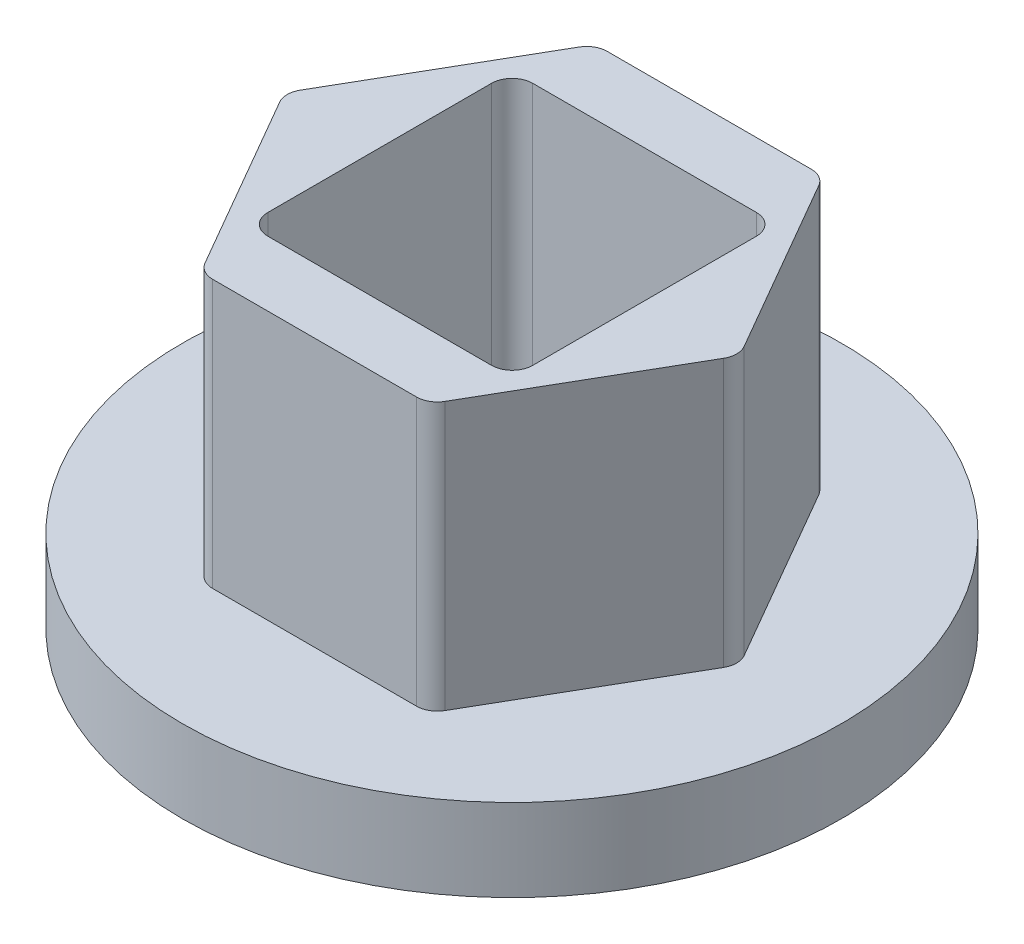
ISO-10303-21;
HEADER;
FILE_DESCRIPTION(('STEP AP214'),'2;1');
FILE_NAME('part.step','',(''),(''),'','','');
FILE_SCHEMA(('AUTOMOTIVE_DESIGN { 1 0 10303 214 1 1 1 1 }'));
ENDSEC;
DATA;
#1=APPLICATION_CONTEXT('core data for automotive mechanical design processes');
#2=APPLICATION_PROTOCOL_DEFINITION('international standard','automotive_design',2000,#1);
#3=PRODUCT_CONTEXT('',#1,'mechanical');
#4=PRODUCT('Part','Part','',(#3));
#5=PRODUCT_RELATED_PRODUCT_CATEGORY('part','',(#4));
#6=PRODUCT_DEFINITION_FORMATION('','',#4);
#7=PRODUCT_DEFINITION_CONTEXT('part definition',#1,'design');
#8=PRODUCT_DEFINITION('design','',#6,#7);
#9=PRODUCT_DEFINITION_SHAPE('','',#8);
#10=(LENGTH_UNIT() NAMED_UNIT(*) SI_UNIT(.MILLI.,.METRE.));
#11=(NAMED_UNIT(*) PLANE_ANGLE_UNIT() SI_UNIT($,.RADIAN.));
#12=(NAMED_UNIT(*) SI_UNIT($,.STERADIAN.) SOLID_ANGLE_UNIT());
#13=UNCERTAINTY_MEASURE_WITH_UNIT(LENGTH_MEASURE(1.E-05),#10,'distance_accuracy_value','');
#14=(GEOMETRIC_REPRESENTATION_CONTEXT(3) GLOBAL_UNCERTAINTY_ASSIGNED_CONTEXT((#13)) GLOBAL_UNIT_ASSIGNED_CONTEXT((#10,
#11,#12)) REPRESENTATION_CONTEXT('',''));
#15=CARTESIAN_POINT('',(0.,0.,0.));
#16=DIRECTION('',(0.,0.,1.));
#17=DIRECTION('',(1.,0.,0.));
#18=AXIS2_PLACEMENT_3D('',#15,#16,#17);
#19=CARTESIAN_POINT('',(-2.76550778941829,6.5,0.261150073207861));
#20=DIRECTION('',(0.,0.,-1.));
#21=DIRECTION('',(-1.,0.,0.));
#22=AXIS2_PLACEMENT_3D('',#19,#20,#21);
#23=PLANE('',#22);
#24=DIRECTION('',(1.,0.,0.));
#25=VECTOR('',#24,1.);
#26=CARTESIAN_POINT('',(-2.76550778941829,0.,0.261150073207861));
#27=LINE('',#26,#25);
#28=CARTESIAN_POINT('',(-2.47683265482348,0.,0.26115007320786));
#29=VERTEX_POINT('',#28);
#30=CARTESIAN_POINT('',(2.47683265482351,0.,0.261150073207841));
#31=VERTEX_POINT('',#30);
#32=EDGE_CURVE('E347',#29,#31,#27,.T.);
#33=ORIENTED_EDGE('',*,*,#32,.T.);
#34=DIRECTION('',(0.,-1.,0.));
#35=VECTOR('',#34,1.);
#36=CARTESIAN_POINT('',(2.47683265482351,6.5,0.261150073207841));
#37=LINE('',#36,#35);
#38=CARTESIAN_POINT('',(2.47683265482351,6.5,0.261150073207841));
#39=VERTEX_POINT('',#38);
#40=EDGE_CURVE('E317',#31,#39,#37,.F.);
#41=ORIENTED_EDGE('',*,*,#40,.T.);
#42=DIRECTION('',(1.,0.,0.));
#43=VECTOR('',#42,1.);
#44=CARTESIAN_POINT('',(-2.76550778941829,6.5,0.261150073207861));
#45=LINE('',#44,#43);
#46=CARTESIAN_POINT('',(-2.47683265482348,6.5,0.26115007320786));
#47=VERTEX_POINT('',#46);
#48=EDGE_CURVE('E370',#47,#39,#45,.T.);
#49=ORIENTED_EDGE('',*,*,#48,.F.);
#50=DIRECTION('',(0.,-1.,0.));
#51=VECTOR('',#50,1.);
#52=CARTESIAN_POINT('',(-2.47683265482348,6.5,0.26115007320786));
#53=LINE('',#52,#51);
#54=EDGE_CURVE('E314',#47,#29,#53,.T.);
#55=ORIENTED_EDGE('',*,*,#54,.T.);
#56=EDGE_LOOP('',(#33,#41,#49,#55));
#57=FACE_BOUND('',#56,.T.);
#58=ADVANCED_FACE('F39',(#57),#23,.F.);
#59=CARTESIAN_POINT('',(2.76550778941833,6.5,0.261150073207839));
#60=DIRECTION('',(-0.86602540378444,0.,-0.499999999999997));
#61=DIRECTION('',(-0.499999999999997,0.,0.86602540378444));
#62=AXIS2_PLACEMENT_3D('',#59,#60,#61);
#63=PLANE('',#62);
#64=DIRECTION('',(0.499999999999997,0.,-0.86602540378444));
#65=VECTOR('',#64,1.);
#66=CARTESIAN_POINT('',(2.76550778941833,0.,0.261150073207839));
#67=LINE('',#66,#65);
#68=CARTESIAN_POINT('',(2.90984535671573,0.,0.0111500732078394));
#69=VERTEX_POINT('',#68);
#70=CARTESIAN_POINT('',(5.38667801153921,0.,-4.27884992679217));
#71=VERTEX_POINT('',#70);
#72=EDGE_CURVE('E335',#69,#71,#67,.T.);
#73=ORIENTED_EDGE('',*,*,#72,.T.);
#74=DIRECTION('',(0.,-1.,0.));
#75=VECTOR('',#74,1.);
#76=CARTESIAN_POINT('',(5.38667801153921,6.5,-4.27884992679217));
#77=LINE('',#76,#75);
#78=CARTESIAN_POINT('',(5.38667801153921,6.5,-4.27884992679217));
#79=VERTEX_POINT('',#78);
#80=EDGE_CURVE('E311',#71,#79,#77,.F.);
#81=ORIENTED_EDGE('',*,*,#80,.T.);
#82=DIRECTION('',(0.499999999999997,0.,-0.86602540378444));
#83=VECTOR('',#82,1.);
#84=CARTESIAN_POINT('',(2.76550778941833,6.5,0.261150073207839));
#85=LINE('',#84,#83);
#86=CARTESIAN_POINT('',(2.90984535671573,6.5,0.0111500732078394));
#87=VERTEX_POINT('',#86);
#88=EDGE_CURVE('E358',#87,#79,#85,.T.);
#89=ORIENTED_EDGE('',*,*,#88,.F.);
#90=DIRECTION('',(0.,-1.,0.));
#91=VECTOR('',#90,1.);
#92=CARTESIAN_POINT('',(2.90984535671573,6.5,0.0111500732078392));
#93=LINE('',#92,#91);
#94=EDGE_CURVE('E307',#87,#69,#93,.T.);
#95=ORIENTED_EDGE('',*,*,#94,.T.);
#96=EDGE_LOOP('',(#73,#81,#89,#95));
#97=FACE_BOUND('',#96,.T.);
#98=ADVANCED_FACE('F342',(#97),#63,.F.);
#99=CARTESIAN_POINT('',(5.53101557883662,6.5,-4.52884992679217));
#100=DIRECTION('',(-0.866025403784437,0.,0.500000000000003));
#101=DIRECTION('',(0.500000000000003,0.,0.866025403784437));
#102=AXIS2_PLACEMENT_3D('',#99,#100,#101);
#103=PLANE('',#102);
#104=DIRECTION('',(-0.500000000000003,0.,-0.866025403784437));
#105=VECTOR('',#104,1.);
#106=CARTESIAN_POINT('',(5.53101557883662,0.,-4.52884992679217));
#107=LINE('',#106,#105);
#108=CARTESIAN_POINT('',(5.38667801153921,0.,-4.77884992679217));
#109=VERTEX_POINT('',#108);
#110=CARTESIAN_POINT('',(2.9098453567157,0.,-9.06884992679216));
#111=VERTEX_POINT('',#110);
#112=EDGE_CURVE('E337',#109,#111,#107,.T.);
#113=ORIENTED_EDGE('',*,*,#112,.T.);
#114=DIRECTION('',(0.,-1.,0.));
#115=VECTOR('',#114,1.);
#116=CARTESIAN_POINT('',(2.9098453567157,6.5,-9.06884992679216));
#117=LINE('',#116,#115);
#118=CARTESIAN_POINT('',(2.9098453567157,6.5,-9.06884992679216));
#119=VERTEX_POINT('',#118);
#120=EDGE_CURVE('E304',#111,#119,#117,.F.);
#121=ORIENTED_EDGE('',*,*,#120,.T.);
#122=DIRECTION('',(-0.500000000000003,0.,-0.866025403784437));
#123=VECTOR('',#122,1.);
#124=CARTESIAN_POINT('',(5.53101557883662,6.5,-4.52884992679217));
#125=LINE('',#124,#123);
#126=CARTESIAN_POINT('',(5.38667801153921,6.5,-4.77884992679217));
#127=VERTEX_POINT('',#126);
#128=EDGE_CURVE('E356',#127,#119,#125,.T.);
#129=ORIENTED_EDGE('',*,*,#128,.F.);
#130=DIRECTION('',(0.,-1.,0.));
#131=VECTOR('',#130,1.);
#132=CARTESIAN_POINT('',(5.38667801153921,6.5,-4.77884992679217));
#133=LINE('',#132,#131);
#134=EDGE_CURVE('E300',#127,#109,#133,.T.);
#135=ORIENTED_EDGE('',*,*,#134,.T.);
#136=EDGE_LOOP('',(#113,#121,#129,#135));
#137=FACE_BOUND('',#136,.T.);
#138=ADVANCED_FACE('F360',(#137),#103,.F.);
#139=CARTESIAN_POINT('',(2.76550778941829,6.5,-9.31884992679216));
#140=DIRECTION('',(0.,0.,1.));
#141=DIRECTION('',(1.,0.,0.));
#142=AXIS2_PLACEMENT_3D('',#139,#140,#141);
#143=PLANE('',#142);
#144=DIRECTION('',(-1.,0.,0.));
#145=VECTOR('',#144,1.);
#146=CARTESIAN_POINT('',(2.76550778941829,0.,-9.31884992679216));
#147=LINE('',#146,#145);
#148=CARTESIAN_POINT('',(2.47683265482348,0.,-9.31884992679216));
#149=VERTEX_POINT('',#148);
#150=CARTESIAN_POINT('',(-2.47683265482351,0.,-9.31884992679214));
#151=VERTEX_POINT('',#150);
#152=EDGE_CURVE('E384',#149,#151,#147,.T.);
#153=ORIENTED_EDGE('',*,*,#152,.T.);
#154=DIRECTION('',(0.,-1.,0.));
#155=VECTOR('',#154,1.);
#156=CARTESIAN_POINT('',(-2.47683265482351,6.5,-9.31884992679214));
#157=LINE('',#156,#155);
#158=CARTESIAN_POINT('',(-2.47683265482351,6.5,-9.31884992679214));
#159=VERTEX_POINT('',#158);
#160=EDGE_CURVE('E297',#151,#159,#157,.F.);
#161=ORIENTED_EDGE('',*,*,#160,.T.);
#162=DIRECTION('',(-1.,0.,0.));
#163=VECTOR('',#162,1.);
#164=CARTESIAN_POINT('',(2.76550778941829,6.5,-9.31884992679216));
#165=LINE('',#164,#163);
#166=CARTESIAN_POINT('',(2.47683265482348,6.5,-9.31884992679216));
#167=VERTEX_POINT('',#166);
#168=EDGE_CURVE('E363',#167,#159,#165,.T.);
#169=ORIENTED_EDGE('',*,*,#168,.F.);
#170=DIRECTION('',(0.,-1.,0.));
#171=VECTOR('',#170,1.);
#172=CARTESIAN_POINT('',(2.47683265482348,6.5,-9.31884992679216));
#173=LINE('',#172,#171);
#174=EDGE_CURVE('E293',#167,#149,#173,.T.);
#175=ORIENTED_EDGE('',*,*,#174,.T.);
#176=EDGE_LOOP('',(#153,#161,#169,#175));
#177=FACE_BOUND('',#176,.T.);
#178=ADVANCED_FACE('F509',(#177),#143,.F.);
#179=CARTESIAN_POINT('',(-2.76550778941833,6.5,-9.31884992679214));
#180=DIRECTION('',(0.86602540378444,0.,0.499999999999997));
#181=DIRECTION('',(0.499999999999997,0.,-0.86602540378444));
#182=AXIS2_PLACEMENT_3D('',#179,#180,#181);
#183=PLANE('',#182);
#184=DIRECTION('',(-0.499999999999997,0.,0.86602540378444));
#185=VECTOR('',#184,1.);
#186=CARTESIAN_POINT('',(-2.76550778941833,0.,-9.31884992679214));
#187=LINE('',#186,#185);
#188=CARTESIAN_POINT('',(-2.90984535671573,0.,-9.06884992679214));
#189=VERTEX_POINT('',#188);
#190=CARTESIAN_POINT('',(-5.38667801153921,0.,-4.77884992679213));
#191=VERTEX_POINT('',#190);
#192=EDGE_CURVE('E388',#189,#191,#187,.T.);
#193=ORIENTED_EDGE('',*,*,#192,.T.);
#194=DIRECTION('',(0.,-1.,0.));
#195=VECTOR('',#194,1.);
#196=CARTESIAN_POINT('',(-5.38667801153921,6.5,-4.77884992679213));
#197=LINE('',#196,#195);
#198=CARTESIAN_POINT('',(-5.38667801153921,6.5,-4.77884992679213));
#199=VERTEX_POINT('',#198);
#200=EDGE_CURVE('E272',#191,#199,#197,.F.);
#201=ORIENTED_EDGE('',*,*,#200,.T.);
#202=DIRECTION('',(-0.499999999999997,0.,0.86602540378444));
#203=VECTOR('',#202,1.);
#204=CARTESIAN_POINT('',(-2.76550778941833,6.5,-9.31884992679214));
#205=LINE('',#204,#203);
#206=CARTESIAN_POINT('',(-2.90984535671573,6.5,-9.06884992679214));
#207=VERTEX_POINT('',#206);
#208=EDGE_CURVE('E368',#207,#199,#205,.T.);
#209=ORIENTED_EDGE('',*,*,#208,.F.);
#210=DIRECTION('',(0.,-1.,0.));
#211=VECTOR('',#210,1.);
#212=CARTESIAN_POINT('',(-2.90984535671573,6.5,-9.06884992679214));
#213=LINE('',#212,#211);
#214=EDGE_CURVE('E268',#207,#189,#213,.T.);
#215=ORIENTED_EDGE('',*,*,#214,.T.);
#216=EDGE_LOOP('',(#193,#201,#209,#215));
#217=FACE_BOUND('',#216,.T.);
#218=ADVANCED_FACE('F456',(#217),#183,.F.);
#219=CARTESIAN_POINT('',(-5.53101557883662,6.5,-4.52884992679213));
#220=DIRECTION('',(0.866025403784437,0.,-0.500000000000003));
#221=DIRECTION('',(-0.500000000000003,0.,-0.866025403784437));
#222=AXIS2_PLACEMENT_3D('',#219,#220,#221);
#223=PLANE('',#222);
#224=DIRECTION('',(0.500000000000003,0.,0.866025403784437));
#225=VECTOR('',#224,1.);
#226=CARTESIAN_POINT('',(-5.53101557883662,6.5,-4.52884992679213));
#227=LINE('',#226,#225);
#228=CARTESIAN_POINT('',(-5.38667801153921,6.5,-4.27884992679213));
#229=VERTEX_POINT('',#228);
#230=CARTESIAN_POINT('',(-2.9098453567157,6.5,0.0111500732078622));
#231=VERTEX_POINT('',#230);
#232=EDGE_CURVE('E215',#229,#231,#227,.T.);
#233=ORIENTED_EDGE('',*,*,#232,.F.);
#234=DIRECTION('',(0.,-1.,0.));
#235=VECTOR('',#234,1.);
#236=CARTESIAN_POINT('',(-5.38667801153921,6.5,-4.27884992679213));
#237=LINE('',#236,#235);
#238=CARTESIAN_POINT('',(-5.38667801153921,0.,-4.27884992679213));
#239=VERTEX_POINT('',#238);
#240=EDGE_CURVE('E264',#229,#239,#237,.T.);
#241=ORIENTED_EDGE('',*,*,#240,.T.);
#242=DIRECTION('',(0.500000000000003,0.,0.866025403784437));
#243=VECTOR('',#242,1.);
#244=CARTESIAN_POINT('',(-5.53101557883662,0.,-4.52884992679213));
#245=LINE('',#244,#243);
#246=CARTESIAN_POINT('',(-2.9098453567157,0.,0.0111500732078622));
#247=VERTEX_POINT('',#246);
#248=EDGE_CURVE('E391',#239,#247,#245,.T.);
#249=ORIENTED_EDGE('',*,*,#248,.T.);
#250=DIRECTION('',(0.,-1.,0.));
#251=VECTOR('',#250,1.);
#252=CARTESIAN_POINT('',(-2.9098453567157,6.5,0.0111500732078622));
#253=LINE('',#252,#251);
#254=EDGE_CURVE('E261',#247,#231,#253,.F.);
#255=ORIENTED_EDGE('',*,*,#254,.T.);
#256=EDGE_LOOP('',(#233,#241,#249,#255));
#257=FACE_BOUND('',#256,.T.);
#258=ADVANCED_FACE('F447',(#257),#223,.F.);
#259=CARTESIAN_POINT('',(0.,6.5,0.));
#260=DIRECTION('',(0.,1.,0.));
#261=DIRECTION('',(0.,0.,1.));
#262=AXIS2_PLACEMENT_3D('',#259,#260,#261);
#263=PLANE('',#262);
#264=DIRECTION('',(-1.,0.,0.));
#265=VECTOR('',#264,1.);
#266=CARTESIAN_POINT('',(0.,6.5,-7.74384992679215));
#267=LINE('',#266,#265);
#268=CARTESIAN_POINT('',(2.72,6.5,-7.74384992679215));
#269=VERTEX_POINT('',#268);
#270=CARTESIAN_POINT('',(-2.71,6.5,-7.74384992679215));
#271=VERTEX_POINT('',#270);
#272=EDGE_CURVE('E405',#269,#271,#267,.T.);
#273=ORIENTED_EDGE('',*,*,#272,.F.);
#274=CARTESIAN_POINT('',(2.72,6.5,-7.24384992679215));
#275=DIRECTION('',(0.,1.,0.));
#276=DIRECTION('',(0.,0.,1.));
#277=AXIS2_PLACEMENT_3D('',#274,#275,#276);
#278=CIRCLE('',#277,0.5);
#279=CARTESIAN_POINT('',(3.22,6.5,-7.24384992679215));
#280=VERTEX_POINT('',#279);
#281=EDGE_CURVE('E247',#269,#280,#278,.F.);
#282=ORIENTED_EDGE('',*,*,#281,.T.);
#283=DIRECTION('',(0.,0.,-1.));
#284=VECTOR('',#283,1.);
#285=CARTESIAN_POINT('',(3.22,6.5,0.));
#286=LINE('',#285,#284);
#287=CARTESIAN_POINT('',(3.22,6.5,-1.81384992679215));
#288=VERTEX_POINT('',#287);
#289=EDGE_CURVE('E418',#288,#280,#286,.T.);
#290=ORIENTED_EDGE('',*,*,#289,.F.);
#291=CARTESIAN_POINT('',(2.72,6.5,-1.81384992679215));
#292=DIRECTION('',(0.,1.,0.));
#293=DIRECTION('',(0.,0.,1.));
#294=AXIS2_PLACEMENT_3D('',#291,#292,#293);
#295=CIRCLE('',#294,0.5);
#296=CARTESIAN_POINT('',(2.72,6.5,-1.31384992679215));
#297=VERTEX_POINT('',#296);
#298=EDGE_CURVE('E187',#288,#297,#295,.F.);
#299=ORIENTED_EDGE('',*,*,#298,.T.);
#300=DIRECTION('',(-1.,0.,0.));
#301=VECTOR('',#300,1.);
#302=CARTESIAN_POINT('',(0.,6.5,-1.31384992679215));
#303=LINE('',#302,#301);
#304=CARTESIAN_POINT('',(-2.71,6.5,-1.31384992679215));
#305=VERTEX_POINT('',#304);
#306=EDGE_CURVE('E197',#297,#305,#303,.T.);
#307=ORIENTED_EDGE('',*,*,#306,.T.);
#308=CARTESIAN_POINT('',(-2.71,6.5,-1.81384992679215));
#309=DIRECTION('',(0.,1.,0.));
#310=DIRECTION('',(0.,0.,1.));
#311=AXIS2_PLACEMENT_3D('',#308,#309,#310);
#312=CIRCLE('',#311,0.5);
#313=CARTESIAN_POINT('',(-3.21,6.5,-1.81384992679215));
#314=VERTEX_POINT('',#313);
#315=EDGE_CURVE('E258',#305,#314,#312,.F.);
#316=ORIENTED_EDGE('',*,*,#315,.T.);
#317=DIRECTION('',(0.,0.,-1.));
#318=VECTOR('',#317,1.);
#319=CARTESIAN_POINT('',(-3.21,6.5,0.));
#320=LINE('',#319,#318);
#321=CARTESIAN_POINT('',(-3.21,6.5,-7.24384992679215));
#322=VERTEX_POINT('',#321);
#323=EDGE_CURVE('E412',#314,#322,#320,.T.);
#324=ORIENTED_EDGE('',*,*,#323,.T.);
#325=CARTESIAN_POINT('',(-2.71,6.5,-7.24384992679215));
#326=DIRECTION('',(0.,1.,0.));
#327=DIRECTION('',(0.,0.,1.));
#328=AXIS2_PLACEMENT_3D('',#325,#326,#327);
#329=CIRCLE('',#328,0.5);
#330=EDGE_CURVE('E253',#322,#271,#329,.F.);
#331=ORIENTED_EDGE('',*,*,#330,.T.);
#332=EDGE_LOOP('',(#273,#282,#290,#299,#307,#316,#324,#331));
#333=FACE_BOUND('',#332,.T.);
#334=ORIENTED_EDGE('',*,*,#208,.T.);
#335=CARTESIAN_POINT('',(-4.95366530964699,6.5,-4.52884992679213));
#336=DIRECTION('',(0.,1.,0.));
#337=DIRECTION('',(0.,0.,1.));
#338=AXIS2_PLACEMENT_3D('',#335,#336,#337);
#339=CIRCLE('',#338,0.5);
#340=EDGE_CURVE('E290',#199,#229,#339,.T.);
#341=ORIENTED_EDGE('',*,*,#340,.T.);
#342=ORIENTED_EDGE('',*,*,#232,.T.);
#343=CARTESIAN_POINT('',(-2.47683265482348,6.5,-0.23884992679214));
#344=DIRECTION('',(0.,1.,0.));
#345=DIRECTION('',(0.,0.,1.));
#346=AXIS2_PLACEMENT_3D('',#343,#344,#345);
#347=CIRCLE('',#346,0.5);
#348=EDGE_CURVE('E275',#231,#47,#347,.T.);
#349=ORIENTED_EDGE('',*,*,#348,.T.);
#350=ORIENTED_EDGE('',*,*,#48,.T.);
#351=CARTESIAN_POINT('',(2.47683265482351,6.5,-0.238849926792159));
#352=DIRECTION('',(0.,1.,0.));
#353=DIRECTION('',(0.,0.,1.));
#354=AXIS2_PLACEMENT_3D('',#351,#352,#353);
#355=CIRCLE('',#354,0.5);
#356=EDGE_CURVE('E278',#39,#87,#355,.T.);
#357=ORIENTED_EDGE('',*,*,#356,.T.);
#358=ORIENTED_EDGE('',*,*,#88,.T.);
#359=CARTESIAN_POINT('',(4.95366530964699,6.5,-4.52884992679217));
#360=DIRECTION('',(0.,1.,0.));
#361=DIRECTION('',(0.,0.,1.));
#362=AXIS2_PLACEMENT_3D('',#359,#360,#361);
#363=CIRCLE('',#362,0.5);
#364=EDGE_CURVE('E281',#79,#127,#363,.T.);
#365=ORIENTED_EDGE('',*,*,#364,.T.);
#366=ORIENTED_EDGE('',*,*,#128,.T.);
#367=CARTESIAN_POINT('',(2.47683265482348,6.5,-8.81884992679216));
#368=DIRECTION('',(0.,1.,0.));
#369=DIRECTION('',(0.,0.,1.));
#370=AXIS2_PLACEMENT_3D('',#367,#368,#369);
#371=CIRCLE('',#370,0.5);
#372=EDGE_CURVE('E284',#119,#167,#371,.T.);
#373=ORIENTED_EDGE('',*,*,#372,.T.);
#374=ORIENTED_EDGE('',*,*,#168,.T.);
#375=CARTESIAN_POINT('',(-2.47683265482351,6.5,-8.81884992679214));
#376=DIRECTION('',(0.,1.,0.));
#377=DIRECTION('',(0.,0.,1.));
#378=AXIS2_PLACEMENT_3D('',#375,#376,#377);
#379=CIRCLE('',#378,0.5);
#380=EDGE_CURVE('E287',#159,#207,#379,.T.);
#381=ORIENTED_EDGE('',*,*,#380,.T.);
#382=EDGE_LOOP('',(#334,#341,#342,#349,#350,#357,#358,#365,#366,#373,#374,#381));
#383=FACE_BOUND('',#382,.T.);
#384=ADVANCED_FACE('F355',(#333,#383),#263,.T.);
#385=CARTESIAN_POINT('',(0.,0.,-4.52884992679215));
#386=DIRECTION('',(0.,1.,0.));
#387=DIRECTION('',(0.,0.,1.));
#388=AXIS2_PLACEMENT_3D('',#385,#386,#387);
#389=PLANE('',#388);
#390=CARTESIAN_POINT('',(0.,0.,-4.52884992679215));
#391=DIRECTION('',(0.,1.,0.));
#392=DIRECTION('',(0.,0.,1.));
#393=AXIS2_PLACEMENT_3D('',#390,#391,#392);
#394=CIRCLE('',#393,8.);
#395=CARTESIAN_POINT('',(0.,0.,3.47115007320785));
#396=VERTEX_POINT('',#395);
#397=EDGE_CURVE('E401',#396,#396,#394,.T.);
#398=ORIENTED_EDGE('',*,*,#397,.T.);
#399=EDGE_LOOP('',(#398));
#400=FACE_BOUND('',#399,.T.);
#401=ORIENTED_EDGE('',*,*,#32,.F.);
#402=CARTESIAN_POINT('',(-2.47683265482348,0.,-0.23884992679214));
#403=DIRECTION('',(0.,1.,0.));
#404=DIRECTION('',(0.,0.,1.));
#405=AXIS2_PLACEMENT_3D('',#402,#403,#404);
#406=CIRCLE('',#405,0.5);
#407=EDGE_CURVE('E11',#29,#247,#406,.F.);
#408=ORIENTED_EDGE('',*,*,#407,.T.);
#409=ORIENTED_EDGE('',*,*,#248,.F.);
#410=CARTESIAN_POINT('',(-4.95366530964699,0.,-4.52884992679213));
#411=DIRECTION('',(0.,1.,0.));
#412=DIRECTION('',(0.,0.,1.));
#413=AXIS2_PLACEMENT_3D('',#410,#411,#412);
#414=CIRCLE('',#413,0.5);
#415=EDGE_CURVE('E320',#239,#191,#414,.F.);
#416=ORIENTED_EDGE('',*,*,#415,.T.);
#417=ORIENTED_EDGE('',*,*,#192,.F.);
#418=CARTESIAN_POINT('',(-2.47683265482351,0.,-8.81884992679214));
#419=DIRECTION('',(0.,1.,0.));
#420=DIRECTION('',(0.,0.,1.));
#421=AXIS2_PLACEMENT_3D('',#418,#419,#420);
#422=CIRCLE('',#421,0.5);
#423=EDGE_CURVE('E323',#189,#151,#422,.F.);
#424=ORIENTED_EDGE('',*,*,#423,.T.);
#425=ORIENTED_EDGE('',*,*,#152,.F.);
#426=CARTESIAN_POINT('',(2.47683265482348,0.,-8.81884992679216));
#427=DIRECTION('',(0.,1.,0.));
#428=DIRECTION('',(0.,0.,1.));
#429=AXIS2_PLACEMENT_3D('',#426,#427,#428);
#430=CIRCLE('',#429,0.5);
#431=EDGE_CURVE('E326',#149,#111,#430,.F.);
#432=ORIENTED_EDGE('',*,*,#431,.T.);
#433=ORIENTED_EDGE('',*,*,#112,.F.);
#434=CARTESIAN_POINT('',(4.95366530964699,0.,-4.52884992679217));
#435=DIRECTION('',(0.,1.,0.));
#436=DIRECTION('',(0.,0.,1.));
#437=AXIS2_PLACEMENT_3D('',#434,#435,#436);
#438=CIRCLE('',#437,0.5);
#439=EDGE_CURVE('E329',#109,#71,#438,.F.);
#440=ORIENTED_EDGE('',*,*,#439,.T.);
#441=ORIENTED_EDGE('',*,*,#72,.F.);
#442=CARTESIAN_POINT('',(2.47683265482351,0.,-0.238849926792159));
#443=DIRECTION('',(0.,1.,0.));
#444=DIRECTION('',(0.,0.,1.));
#445=AXIS2_PLACEMENT_3D('',#442,#443,#444);
#446=CIRCLE('',#445,0.5);
#447=EDGE_CURVE('E48',#69,#31,#446,.F.);
#448=ORIENTED_EDGE('',*,*,#447,.T.);
#449=EDGE_LOOP('',(#401,#408,#409,#416,#417,#424,#425,#432,#433,#440,#441,#448));
#450=FACE_BOUND('',#449,.T.);
#451=ADVANCED_FACE('F334',(#400,#450),#389,.T.);
#452=CARTESIAN_POINT('',(0.,-2.,-4.52884992679215));
#453=DIRECTION('',(0.,1.,0.));
#454=DIRECTION('',(0.,0.,1.));
#455=AXIS2_PLACEMENT_3D('',#452,#453,#454);
#456=CYLINDRICAL_SURFACE('',#455,8.);
#457=CARTESIAN_POINT('',(0.,-2.,-4.52884992679215));
#458=DIRECTION('',(0.,1.,0.));
#459=DIRECTION('',(0.,0.,1.));
#460=AXIS2_PLACEMENT_3D('',#457,#458,#459);
#461=CIRCLE('',#460,8.);
#462=CARTESIAN_POINT('',(0.,-2.,3.47115007320785));
#463=VERTEX_POINT('',#462);
#464=EDGE_CURVE('E380',#463,#463,#461,.T.);
#465=ORIENTED_EDGE('',*,*,#464,.T.);
#466=EDGE_LOOP('',(#465));
#467=FACE_BOUND('',#466,.T.);
#468=ORIENTED_EDGE('',*,*,#397,.F.);
#469=EDGE_LOOP('',(#468));
#470=FACE_BOUND('',#469,.T.);
#471=ADVANCED_FACE('F453',(#467,#470),#456,.T.);
#472=CARTESIAN_POINT('',(0.,-2.,-4.52884992679215));
#473=DIRECTION('',(0.,1.,0.));
#474=DIRECTION('',(0.,0.,1.));
#475=AXIS2_PLACEMENT_3D('',#472,#473,#474);
#476=PLANE('',#475);
#477=DIRECTION('',(-1.,0.,0.));
#478=VECTOR('',#477,1.);
#479=CARTESIAN_POINT('',(0.,-2.,-1.31384992679215));
#480=LINE('',#479,#478);
#481=CARTESIAN_POINT('',(2.72,-2.,-1.31384992679215));
#482=VERTEX_POINT('',#481);
#483=CARTESIAN_POINT('',(-2.71,-2.,-1.31384992679215));
#484=VERTEX_POINT('',#483);
#485=EDGE_CURVE('E194',#482,#484,#480,.T.);
#486=ORIENTED_EDGE('',*,*,#485,.F.);
#487=CARTESIAN_POINT('',(2.72,-2.,-1.81384992679215));
#488=DIRECTION('',(0.,1.,0.));
#489=DIRECTION('',(0.,0.,1.));
#490=AXIS2_PLACEMENT_3D('',#487,#488,#489);
#491=CIRCLE('',#490,0.5);
#492=CARTESIAN_POINT('',(3.22,-2.,-1.81384992679215));
#493=VERTEX_POINT('',#492);
#494=EDGE_CURVE('E176',#482,#493,#491,.T.);
#495=ORIENTED_EDGE('',*,*,#494,.T.);
#496=DIRECTION('',(0.,0.,-1.));
#497=VECTOR('',#496,1.);
#498=CARTESIAN_POINT('',(3.22,-2.,-4.52884992679215));
#499=LINE('',#498,#497);
#500=CARTESIAN_POINT('',(3.22,-2.,-7.24384992679215));
#501=VERTEX_POINT('',#500);
#502=EDGE_CURVE('E208',#493,#501,#499,.T.);
#503=ORIENTED_EDGE('',*,*,#502,.T.);
#504=CARTESIAN_POINT('',(2.72,-2.,-7.24384992679215));
#505=DIRECTION('',(0.,1.,0.));
#506=DIRECTION('',(0.,0.,1.));
#507=AXIS2_PLACEMENT_3D('',#504,#505,#506);
#508=CIRCLE('',#507,0.5);
#509=CARTESIAN_POINT('',(2.72,-2.,-7.74384992679215));
#510=VERTEX_POINT('',#509);
#511=EDGE_CURVE('E244',#501,#510,#508,.T.);
#512=ORIENTED_EDGE('',*,*,#511,.T.);
#513=DIRECTION('',(-1.,0.,0.));
#514=VECTOR('',#513,1.);
#515=CARTESIAN_POINT('',(0.,-2.,-7.74384992679215));
#516=LINE('',#515,#514);
#517=CARTESIAN_POINT('',(-2.71,-2.,-7.74384992679215));
#518=VERTEX_POINT('',#517);
#519=EDGE_CURVE('E213',#510,#518,#516,.T.);
#520=ORIENTED_EDGE('',*,*,#519,.T.);
#521=CARTESIAN_POINT('',(-2.71,-2.,-7.24384992679215));
#522=DIRECTION('',(0.,1.,0.));
#523=DIRECTION('',(0.,0.,1.));
#524=AXIS2_PLACEMENT_3D('',#521,#522,#523);
#525=CIRCLE('',#524,0.5);
#526=CARTESIAN_POINT('',(-3.21,-2.,-7.24384992679215));
#527=VERTEX_POINT('',#526);
#528=EDGE_CURVE('E250',#518,#527,#525,.T.);
#529=ORIENTED_EDGE('',*,*,#528,.T.);
#530=DIRECTION('',(0.,0.,-1.));
#531=VECTOR('',#530,1.);
#532=CARTESIAN_POINT('',(-3.21,-2.,-4.52884992679215));
#533=LINE('',#532,#531);
#534=CARTESIAN_POINT('',(-3.21,-2.,-1.81384992679215));
#535=VERTEX_POINT('',#534);
#536=EDGE_CURVE('E207',#535,#527,#533,.T.);
#537=ORIENTED_EDGE('',*,*,#536,.F.);
#538=CARTESIAN_POINT('',(-2.71,-2.,-1.81384992679215));
#539=DIRECTION('',(0.,1.,0.));
#540=DIRECTION('',(0.,0.,1.));
#541=AXIS2_PLACEMENT_3D('',#538,#539,#540);
#542=CIRCLE('',#541,0.5);
#543=EDGE_CURVE('E205',#535,#484,#542,.T.);
#544=ORIENTED_EDGE('',*,*,#543,.T.);
#545=EDGE_LOOP('',(#486,#495,#503,#512,#520,#529,#537,#544));
#546=FACE_BOUND('',#545,.T.);
#547=ORIENTED_EDGE('',*,*,#464,.F.);
#548=EDGE_LOOP('',(#547));
#549=FACE_BOUND('',#548,.T.);
#550=ADVANCED_FACE('F202',(#546,#549),#476,.F.);
#551=CARTESIAN_POINT('',(-3.21,7.37,-7.74384992679215));
#552=DIRECTION('',(0.,0.,-1.));
#553=DIRECTION('',(-1.,0.,0.));
#554=AXIS2_PLACEMENT_3D('',#551,#552,#553);
#555=PLANE('',#554);
#556=ORIENTED_EDGE('',*,*,#519,.F.);
#557=DIRECTION('',(0.,-1.,0.));
#558=VECTOR('',#557,1.);
#559=CARTESIAN_POINT('',(2.72,6.5,-7.74384992679215));
#560=LINE('',#559,#558);
#561=EDGE_CURVE('E233',#510,#269,#560,.F.);
#562=ORIENTED_EDGE('',*,*,#561,.T.);
#563=ORIENTED_EDGE('',*,*,#272,.T.);
#564=DIRECTION('',(0.,-1.,0.));
#565=VECTOR('',#564,1.);
#566=CARTESIAN_POINT('',(-2.71,7.37,-7.74384992679215));
#567=LINE('',#566,#565);
#568=EDGE_CURVE('E229',#271,#518,#567,.T.);
#569=ORIENTED_EDGE('',*,*,#568,.T.);
#570=EDGE_LOOP('',(#556,#562,#563,#569));
#571=FACE_BOUND('',#570,.T.);
#572=ADVANCED_FACE('F432',(#571),#555,.F.);
#573=CARTESIAN_POINT('',(-3.21,7.37,-7.74384992679215));
#574=DIRECTION('',(1.,0.,0.));
#575=DIRECTION('',(0.,0.,-1.));
#576=AXIS2_PLACEMENT_3D('',#573,#574,#575);
#577=PLANE('',#576);
#578=ORIENTED_EDGE('',*,*,#536,.T.);
#579=DIRECTION('',(0.,-1.,0.));
#580=VECTOR('',#579,1.);
#581=CARTESIAN_POINT('',(-3.21,7.37,-7.24384992679215));
#582=LINE('',#581,#580);
#583=EDGE_CURVE('E188',#527,#322,#582,.F.);
#584=ORIENTED_EDGE('',*,*,#583,.T.);
#585=ORIENTED_EDGE('',*,*,#323,.F.);
#586=DIRECTION('',(0.,-1.,0.));
#587=VECTOR('',#586,1.);
#588=CARTESIAN_POINT('',(-3.21,-2.,-1.81384992679215));
#589=LINE('',#588,#587);
#590=EDGE_CURVE('E236',#314,#535,#589,.T.);
#591=ORIENTED_EDGE('',*,*,#590,.T.);
#592=EDGE_LOOP('',(#578,#584,#585,#591));
#593=FACE_BOUND('',#592,.T.);
#594=ADVANCED_FACE('F440',(#593),#577,.T.);
#595=CARTESIAN_POINT('',(-3.21,7.37,-1.31384992679215));
#596=DIRECTION('',(0.,0.,-1.));
#597=DIRECTION('',(-1.,0.,0.));
#598=AXIS2_PLACEMENT_3D('',#595,#596,#597);
#599=PLANE('',#598);
#600=ORIENTED_EDGE('',*,*,#306,.F.);
#601=DIRECTION('',(0.,-1.,0.));
#602=VECTOR('',#601,1.);
#603=CARTESIAN_POINT('',(2.72,7.37,-1.31384992679215));
#604=LINE('',#603,#602);
#605=EDGE_CURVE('E180',#297,#482,#604,.T.);
#606=ORIENTED_EDGE('',*,*,#605,.T.);
#607=ORIENTED_EDGE('',*,*,#485,.T.);
#608=DIRECTION('',(0.,-1.,0.));
#609=VECTOR('',#608,1.);
#610=CARTESIAN_POINT('',(-2.71,6.5,-1.31384992679215));
#611=LINE('',#610,#609);
#612=EDGE_CURVE('E200',#484,#305,#611,.F.);
#613=ORIENTED_EDGE('',*,*,#612,.T.);
#614=EDGE_LOOP('',(#600,#606,#607,#613));
#615=FACE_BOUND('',#614,.T.);
#616=ADVANCED_FACE('F193',(#615),#599,.T.);
#617=CARTESIAN_POINT('',(3.22,7.37,-7.74384992679215));
#618=DIRECTION('',(1.,0.,0.));
#619=DIRECTION('',(0.,0.,-1.));
#620=AXIS2_PLACEMENT_3D('',#617,#618,#619);
#621=PLANE('',#620);
#622=ORIENTED_EDGE('',*,*,#502,.F.);
#623=DIRECTION('',(0.,-1.,0.));
#624=VECTOR('',#623,1.);
#625=CARTESIAN_POINT('',(3.22,7.37,-1.81384992679215));
#626=LINE('',#625,#624);
#627=EDGE_CURVE('E181',#493,#288,#626,.F.);
#628=ORIENTED_EDGE('',*,*,#627,.T.);
#629=ORIENTED_EDGE('',*,*,#289,.T.);
#630=DIRECTION('',(0.,-1.,0.));
#631=VECTOR('',#630,1.);
#632=CARTESIAN_POINT('',(3.22,-2.,-7.24384992679215));
#633=LINE('',#632,#631);
#634=EDGE_CURVE('E199',#280,#501,#633,.T.);
#635=ORIENTED_EDGE('',*,*,#634,.T.);
#636=EDGE_LOOP('',(#622,#628,#629,#635));
#637=FACE_BOUND('',#636,.T.);
#638=ADVANCED_FACE('F424',(#637),#621,.F.);
#639=CARTESIAN_POINT('',(2.72,7.37,-1.81384992679215));
#640=DIRECTION('',(0.,-1.,0.));
#641=DIRECTION('',(0.,0.,-1.));
#642=AXIS2_PLACEMENT_3D('',#639,#640,#641);
#643=CYLINDRICAL_SURFACE('',#642,0.5);
#644=ORIENTED_EDGE('',*,*,#298,.F.);
#645=ORIENTED_EDGE('',*,*,#627,.F.);
#646=ORIENTED_EDGE('',*,*,#494,.F.);
#647=ORIENTED_EDGE('',*,*,#605,.F.);
#648=EDGE_LOOP('',(#644,#645,#646,#647));
#649=FACE_BOUND('',#648,.T.);
#650=ADVANCED_FACE('F179',(#649),#643,.F.);
#651=CARTESIAN_POINT('',(2.72,7.37,-7.24384992679215));
#652=DIRECTION('',(0.,1.,0.));
#653=DIRECTION('',(0.,0.,1.));
#654=AXIS2_PLACEMENT_3D('',#651,#652,#653);
#655=CYLINDRICAL_SURFACE('',#654,0.5);
#656=ORIENTED_EDGE('',*,*,#281,.F.);
#657=ORIENTED_EDGE('',*,*,#561,.F.);
#658=ORIENTED_EDGE('',*,*,#511,.F.);
#659=ORIENTED_EDGE('',*,*,#634,.F.);
#660=EDGE_LOOP('',(#656,#657,#658,#659));
#661=FACE_BOUND('',#660,.T.);
#662=ADVANCED_FACE('F428',(#661),#655,.F.);
#663=CARTESIAN_POINT('',(-2.71,7.37,-7.24384992679215));
#664=DIRECTION('',(0.,-1.,0.));
#665=DIRECTION('',(0.,0.,-1.));
#666=AXIS2_PLACEMENT_3D('',#663,#664,#665);
#667=CYLINDRICAL_SURFACE('',#666,0.5);
#668=ORIENTED_EDGE('',*,*,#330,.F.);
#669=ORIENTED_EDGE('',*,*,#583,.F.);
#670=ORIENTED_EDGE('',*,*,#528,.F.);
#671=ORIENTED_EDGE('',*,*,#568,.F.);
#672=EDGE_LOOP('',(#668,#669,#670,#671));
#673=FACE_BOUND('',#672,.T.);
#674=ADVANCED_FACE('F437',(#673),#667,.F.);
#675=CARTESIAN_POINT('',(-2.71,7.37,-1.81384992679215));
#676=DIRECTION('',(0.,1.,0.));
#677=DIRECTION('',(0.,0.,1.));
#678=AXIS2_PLACEMENT_3D('',#675,#676,#677);
#679=CYLINDRICAL_SURFACE('',#678,0.5);
#680=ORIENTED_EDGE('',*,*,#315,.F.);
#681=ORIENTED_EDGE('',*,*,#612,.F.);
#682=ORIENTED_EDGE('',*,*,#543,.F.);
#683=ORIENTED_EDGE('',*,*,#590,.F.);
#684=EDGE_LOOP('',(#680,#681,#682,#683));
#685=FACE_BOUND('',#684,.T.);
#686=ADVANCED_FACE('F445',(#685),#679,.F.);
#687=CARTESIAN_POINT('',(-4.95366530964699,6.5,-4.52884992679213));
#688=DIRECTION('',(0.,-1.,0.));
#689=DIRECTION('',(0.,0.,-1.));
#690=AXIS2_PLACEMENT_3D('',#687,#688,#689);
#691=CYLINDRICAL_SURFACE('',#690,0.5);
#692=ORIENTED_EDGE('',*,*,#340,.F.);
#693=ORIENTED_EDGE('',*,*,#200,.F.);
#694=ORIENTED_EDGE('',*,*,#415,.F.);
#695=ORIENTED_EDGE('',*,*,#240,.F.);
#696=EDGE_LOOP('',(#692,#693,#694,#695));
#697=FACE_BOUND('',#696,.T.);
#698=ADVANCED_FACE('F476',(#697),#691,.T.);
#699=CARTESIAN_POINT('',(-2.47683265482351,6.5,-8.81884992679214));
#700=DIRECTION('',(0.,-1.,0.));
#701=DIRECTION('',(0.,0.,-1.));
#702=AXIS2_PLACEMENT_3D('',#699,#700,#701);
#703=CYLINDRICAL_SURFACE('',#702,0.5);
#704=ORIENTED_EDGE('',*,*,#380,.F.);
#705=ORIENTED_EDGE('',*,*,#160,.F.);
#706=ORIENTED_EDGE('',*,*,#423,.F.);
#707=ORIENTED_EDGE('',*,*,#214,.F.);
#708=EDGE_LOOP('',(#704,#705,#706,#707));
#709=FACE_BOUND('',#708,.T.);
#710=ADVANCED_FACE('F479',(#709),#703,.T.);
#711=CARTESIAN_POINT('',(2.47683265482348,6.5,-8.81884992679216));
#712=DIRECTION('',(0.,-1.,0.));
#713=DIRECTION('',(0.,0.,-1.));
#714=AXIS2_PLACEMENT_3D('',#711,#712,#713);
#715=CYLINDRICAL_SURFACE('',#714,0.5);
#716=ORIENTED_EDGE('',*,*,#372,.F.);
#717=ORIENTED_EDGE('',*,*,#120,.F.);
#718=ORIENTED_EDGE('',*,*,#431,.F.);
#719=ORIENTED_EDGE('',*,*,#174,.F.);
#720=EDGE_LOOP('',(#716,#717,#718,#719));
#721=FACE_BOUND('',#720,.T.);
#722=ADVANCED_FACE('F483',(#721),#715,.T.);
#723=CARTESIAN_POINT('',(4.95366530964699,6.5,-4.52884992679217));
#724=DIRECTION('',(0.,-1.,0.));
#725=DIRECTION('',(0.,0.,-1.));
#726=AXIS2_PLACEMENT_3D('',#723,#724,#725);
#727=CYLINDRICAL_SURFACE('',#726,0.5);
#728=ORIENTED_EDGE('',*,*,#364,.F.);
#729=ORIENTED_EDGE('',*,*,#80,.F.);
#730=ORIENTED_EDGE('',*,*,#439,.F.);
#731=ORIENTED_EDGE('',*,*,#134,.F.);
#732=EDGE_LOOP('',(#728,#729,#730,#731));
#733=FACE_BOUND('',#732,.T.);
#734=ADVANCED_FACE('F350',(#733),#727,.T.);
#735=CARTESIAN_POINT('',(2.47683265482351,6.5,-0.238849926792159));
#736=DIRECTION('',(0.,-1.,0.));
#737=DIRECTION('',(0.,0.,-1.));
#738=AXIS2_PLACEMENT_3D('',#735,#736,#737);
#739=CYLINDRICAL_SURFACE('',#738,0.5);
#740=ORIENTED_EDGE('',*,*,#356,.F.);
#741=ORIENTED_EDGE('',*,*,#40,.F.);
#742=ORIENTED_EDGE('',*,*,#447,.F.);
#743=ORIENTED_EDGE('',*,*,#94,.F.);
#744=EDGE_LOOP('',(#740,#741,#742,#743));
#745=FACE_BOUND('',#744,.T.);
#746=ADVANCED_FACE('F489',(#745),#739,.T.);
#747=CARTESIAN_POINT('',(-2.47683265482348,6.5,-0.23884992679214));
#748=DIRECTION('',(0.,-1.,0.));
#749=DIRECTION('',(0.,0.,-1.));
#750=AXIS2_PLACEMENT_3D('',#747,#748,#749);
#751=CYLINDRICAL_SURFACE('',#750,0.5);
#752=ORIENTED_EDGE('',*,*,#348,.F.);
#753=ORIENTED_EDGE('',*,*,#254,.F.);
#754=ORIENTED_EDGE('',*,*,#407,.F.);
#755=ORIENTED_EDGE('',*,*,#54,.F.);
#756=EDGE_LOOP('',(#752,#753,#754,#755));
#757=FACE_BOUND('',#756,.T.);
#758=ADVANCED_FACE('F41',(#757),#751,.T.);
#759=CLOSED_SHELL('',(#58,#98,#138,#178,#218,#258,#384,#451,#471,#550,#572,#594,#616,#638,#650,
#662,#674,#686,#698,#710,#722,#734,#746,#758));
#760=MANIFOLD_SOLID_BREP('B2',#759);
#761=ADVANCED_BREP_SHAPE_REPRESENTATION('',(#18,#760),#14);
#762=SHAPE_DEFINITION_REPRESENTATION(#9,#761);
ENDSEC;
END-ISO-10303-21;
